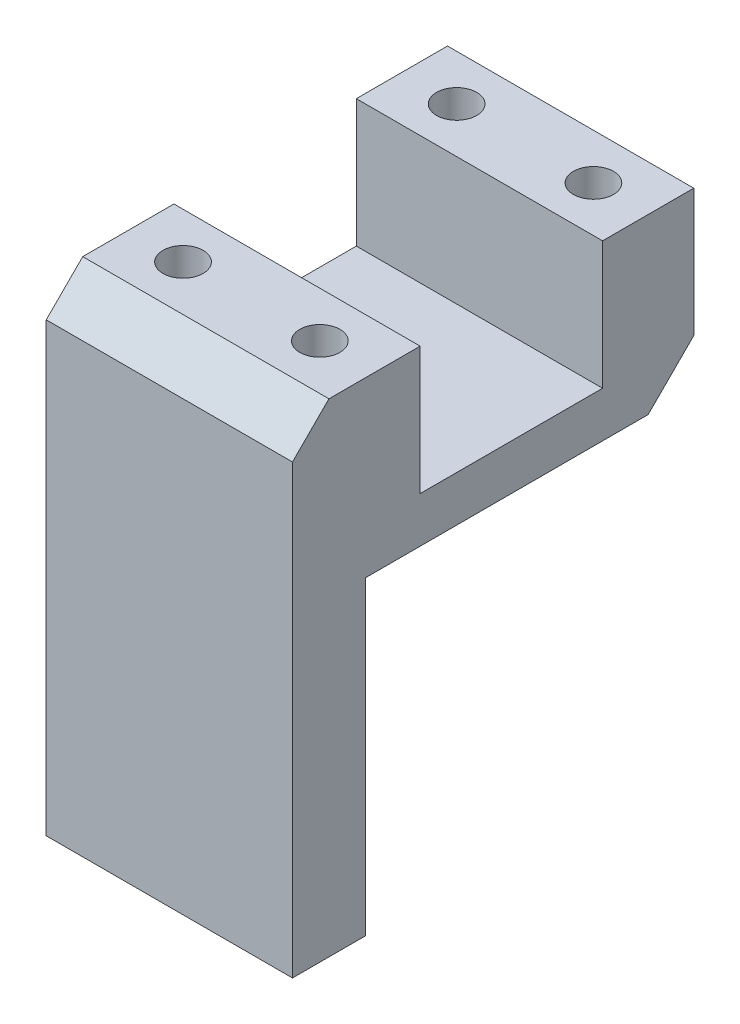
ISO-10303-21;
HEADER;
FILE_DESCRIPTION(('STEP AP214'),'2;1');
FILE_NAME('part.step','',(''),(''),'','','');
FILE_SCHEMA(('AUTOMOTIVE_DESIGN { 1 0 10303 214 1 1 1 1 }'));
ENDSEC;
DATA;
#1=APPLICATION_CONTEXT('core data for automotive mechanical design processes');
#2=APPLICATION_PROTOCOL_DEFINITION('international standard','automotive_design',2000,#1);
#3=PRODUCT_CONTEXT('',#1,'mechanical');
#4=PRODUCT('Part','Part','',(#3));
#5=PRODUCT_RELATED_PRODUCT_CATEGORY('part','',(#4));
#6=PRODUCT_DEFINITION_FORMATION('','',#4);
#7=PRODUCT_DEFINITION_CONTEXT('part definition',#1,'design');
#8=PRODUCT_DEFINITION('design','',#6,#7);
#9=PRODUCT_DEFINITION_SHAPE('','',#8);
#10=(LENGTH_UNIT() NAMED_UNIT(*) SI_UNIT(.MILLI.,.METRE.));
#11=(NAMED_UNIT(*) PLANE_ANGLE_UNIT() SI_UNIT($,.RADIAN.));
#12=(NAMED_UNIT(*) SI_UNIT($,.STERADIAN.) SOLID_ANGLE_UNIT());
#13=UNCERTAINTY_MEASURE_WITH_UNIT(LENGTH_MEASURE(1.E-05),#10,'distance_accuracy_value','');
#14=(GEOMETRIC_REPRESENTATION_CONTEXT(3) GLOBAL_UNCERTAINTY_ASSIGNED_CONTEXT((#13)) GLOBAL_UNIT_ASSIGNED_CONTEXT((#10,
#11,#12)) REPRESENTATION_CONTEXT('',''));
#15=CARTESIAN_POINT('',(0.,0.,0.));
#16=DIRECTION('',(0.,0.,1.));
#17=DIRECTION('',(1.,0.,0.));
#18=AXIS2_PLACEMENT_3D('',#15,#16,#17);
#19=CARTESIAN_POINT('',(8.5725,-2.54,2.54));
#20=DIRECTION('',(0.,1.,0.));
#21=DIRECTION('',(0.,0.,1.));
#22=AXIS2_PLACEMENT_3D('',#19,#20,#21);
#23=PLANE('',#22);
#24=DIRECTION('',(0.,0.,-1.));
#25=VECTOR('',#24,1.);
#26=CARTESIAN_POINT('',(-8.5725,-2.54,2.54));
#27=LINE('',#26,#25);
#28=CARTESIAN_POINT('',(-8.5725,-2.54,2.54));
#29=VERTEX_POINT('',#28);
#30=CARTESIAN_POINT('',(-8.5725,-2.54,-2.54));
#31=VERTEX_POINT('',#30);
#32=EDGE_CURVE('E464',#29,#31,#27,.T.);
#33=ORIENTED_EDGE('',*,*,#32,.T.);
#34=DIRECTION('',(-1.,0.,0.));
#35=VECTOR('',#34,1.);
#36=CARTESIAN_POINT('',(8.5725,-2.54,-2.54));
#37=LINE('',#36,#35);
#38=CARTESIAN_POINT('',(8.5725,-2.54,-2.54));
#39=VERTEX_POINT('',#38);
#40=EDGE_CURVE('E11',#39,#31,#37,.T.);
#41=ORIENTED_EDGE('',*,*,#40,.F.);
#42=DIRECTION('',(0.,0.,-1.));
#43=VECTOR('',#42,1.);
#44=CARTESIAN_POINT('',(8.5725,-2.54,2.54));
#45=LINE('',#44,#43);
#46=CARTESIAN_POINT('',(8.5725,-2.54,2.54));
#47=VERTEX_POINT('',#46);
#48=EDGE_CURVE('E504',#47,#39,#45,.T.);
#49=ORIENTED_EDGE('',*,*,#48,.F.);
#50=DIRECTION('',(-1.,0.,0.));
#51=VECTOR('',#50,1.);
#52=CARTESIAN_POINT('',(8.5725,-2.54,2.54));
#53=LINE('',#52,#51);
#54=EDGE_CURVE('E477',#47,#29,#53,.T.);
#55=ORIENTED_EDGE('',*,*,#54,.T.);
#56=EDGE_LOOP('',(#33,#41,#49,#55));
#57=FACE_BOUND('',#56,.T.);
#58=ADVANCED_FACE('F372',(#57),#23,.F.);
#59=CARTESIAN_POINT('',(8.5725,-2.54,-2.54));
#60=DIRECTION('',(0.,0.,1.));
#61=DIRECTION('',(0.,-1.,0.));
#62=AXIS2_PLACEMENT_3D('',#59,#60,#61);
#63=PLANE('',#62);
#64=DIRECTION('',(0.,1.,0.));
#65=VECTOR('',#64,1.);
#66=CARTESIAN_POINT('',(-8.5725,-2.54,-2.54));
#67=LINE('',#66,#65);
#68=CARTESIAN_POINT('',(-8.5725,19.05,-2.54));
#69=VERTEX_POINT('',#68);
#70=EDGE_CURVE('E460',#31,#69,#67,.T.);
#71=ORIENTED_EDGE('',*,*,#70,.T.);
#72=DIRECTION('',(-1.,0.,0.));
#73=VECTOR('',#72,1.);
#74=CARTESIAN_POINT('',(8.5725,19.05,-2.54));
#75=LINE('',#74,#73);
#76=CARTESIAN_POINT('',(8.5725,19.05,-2.54));
#77=VERTEX_POINT('',#76);
#78=EDGE_CURVE('E379',#77,#69,#75,.T.);
#79=ORIENTED_EDGE('',*,*,#78,.F.);
#80=DIRECTION('',(0.,1.,0.));
#81=VECTOR('',#80,1.);
#82=CARTESIAN_POINT('',(8.5725,-2.54,-2.54));
#83=LINE('',#82,#81);
#84=EDGE_CURVE('E473',#39,#77,#83,.T.);
#85=ORIENTED_EDGE('',*,*,#84,.F.);
#86=ORIENTED_EDGE('',*,*,#40,.T.);
#87=EDGE_LOOP('',(#71,#79,#85,#86));
#88=FACE_BOUND('',#87,.T.);
#89=ADVANCED_FACE('F472',(#88),#63,.F.);
#90=CARTESIAN_POINT('',(8.5725,19.05,-2.54));
#91=DIRECTION('',(0.,1.,0.));
#92=DIRECTION('',(0.,0.,1.));
#93=AXIS2_PLACEMENT_3D('',#90,#91,#92);
#94=PLANE('',#93);
#95=DIRECTION('',(0.,0.,-1.));
#96=VECTOR('',#95,1.);
#97=CARTESIAN_POINT('',(-8.5725,19.05,-2.54));
#98=LINE('',#97,#96);
#99=CARTESIAN_POINT('',(-8.5725,19.05,-22.225));
#100=VERTEX_POINT('',#99);
#101=EDGE_CURVE('E466',#69,#100,#98,.T.);
#102=ORIENTED_EDGE('',*,*,#101,.T.);
#103=DIRECTION('',(-1.,0.,0.));
#104=VECTOR('',#103,1.);
#105=CARTESIAN_POINT('',(8.5725,19.05,-22.225));
#106=LINE('',#105,#104);
#107=CARTESIAN_POINT('',(8.5725,19.05,-22.225));
#108=VERTEX_POINT('',#107);
#109=EDGE_CURVE('E550',#108,#100,#106,.T.);
#110=ORIENTED_EDGE('',*,*,#109,.F.);
#111=DIRECTION('',(0.,0.,-1.));
#112=VECTOR('',#111,1.);
#113=CARTESIAN_POINT('',(8.5725,19.05,-2.54));
#114=LINE('',#113,#112);
#115=EDGE_CURVE('E507',#77,#108,#114,.T.);
#116=ORIENTED_EDGE('',*,*,#115,.F.);
#117=ORIENTED_EDGE('',*,*,#78,.T.);
#118=EDGE_LOOP('',(#102,#110,#116,#117));
#119=FACE_BOUND('',#118,.T.);
#120=ADVANCED_FACE('F554',(#119),#94,.F.);
#121=CARTESIAN_POINT('',(8.5725,19.05,-22.225));
#122=DIRECTION('',(0.,0.707106781186546,0.707106781186549));
#123=DIRECTION('',(0.,-0.707106781186549,0.707106781186546));
#124=AXIS2_PLACEMENT_3D('',#121,#122,#123);
#125=PLANE('',#124);
#126=DIRECTION('',(0.,0.707106781186549,-0.707106781186546));
#127=VECTOR('',#126,1.);
#128=CARTESIAN_POINT('',(-8.5725,19.05,-22.225));
#129=LINE('',#128,#127);
#130=CARTESIAN_POINT('',(-8.5725,22.225,-25.4));
#131=VERTEX_POINT('',#130);
#132=EDGE_CURVE('E486',#100,#131,#129,.T.);
#133=ORIENTED_EDGE('',*,*,#132,.T.);
#134=DIRECTION('',(-1.,0.,0.));
#135=VECTOR('',#134,1.);
#136=CARTESIAN_POINT('',(8.5725,22.225,-25.4));
#137=LINE('',#136,#135);
#138=CARTESIAN_POINT('',(8.5725,22.225,-25.4));
#139=VERTEX_POINT('',#138);
#140=EDGE_CURVE('E547',#139,#131,#137,.T.);
#141=ORIENTED_EDGE('',*,*,#140,.F.);
#142=DIRECTION('',(0.,0.707106781186549,-0.707106781186546));
#143=VECTOR('',#142,1.);
#144=CARTESIAN_POINT('',(8.5725,19.05,-22.225));
#145=LINE('',#144,#143);
#146=EDGE_CURVE('E509',#108,#139,#145,.T.);
#147=ORIENTED_EDGE('',*,*,#146,.F.);
#148=ORIENTED_EDGE('',*,*,#109,.T.);
#149=EDGE_LOOP('',(#133,#141,#147,#148));
#150=FACE_BOUND('',#149,.T.);
#151=ADVANCED_FACE('F562',(#150),#125,.F.);
#152=CARTESIAN_POINT('',(8.5725,22.225,-25.4));
#153=DIRECTION('',(0.,0.,1.));
#154=DIRECTION('',(1.,0.,0.));
#155=AXIS2_PLACEMENT_3D('',#152,#153,#154);
#156=PLANE('',#155);
#157=DIRECTION('',(0.,1.,0.));
#158=VECTOR('',#157,1.);
#159=CARTESIAN_POINT('',(-8.5725,22.225,-25.4));
#160=LINE('',#159,#158);
#161=CARTESIAN_POINT('',(-8.5725,31.115,-25.4));
#162=VERTEX_POINT('',#161);
#163=EDGE_CURVE('E488',#131,#162,#160,.T.);
#164=ORIENTED_EDGE('',*,*,#163,.T.);
#165=DIRECTION('',(-1.,0.,0.));
#166=VECTOR('',#165,1.);
#167=CARTESIAN_POINT('',(8.5725,31.115,-25.4));
#168=LINE('',#167,#166);
#169=CARTESIAN_POINT('',(8.5725,31.115,-25.4));
#170=VERTEX_POINT('',#169);
#171=EDGE_CURVE('E544',#170,#162,#168,.T.);
#172=ORIENTED_EDGE('',*,*,#171,.F.);
#173=DIRECTION('',(0.,1.,0.));
#174=VECTOR('',#173,1.);
#175=CARTESIAN_POINT('',(8.5725,22.225,-25.4));
#176=LINE('',#175,#174);
#177=EDGE_CURVE('E511',#139,#170,#176,.T.);
#178=ORIENTED_EDGE('',*,*,#177,.F.);
#179=ORIENTED_EDGE('',*,*,#140,.T.);
#180=EDGE_LOOP('',(#164,#172,#178,#179));
#181=FACE_BOUND('',#180,.T.);
#182=ADVANCED_FACE('F565',(#181),#156,.F.);
#183=CARTESIAN_POINT('',(8.5725,31.115,-25.4));
#184=DIRECTION('',(0.,-1.,0.));
#185=DIRECTION('',(0.,0.,-1.));
#186=AXIS2_PLACEMENT_3D('',#183,#184,#185);
#187=PLANE('',#186);
#188=CARTESIAN_POINT('',(-4.7625,31.115,-22.225));
#189=DIRECTION('',(0.,1.,0.));
#190=DIRECTION('',(0.,0.,1.));
#191=AXIS2_PLACEMENT_3D('',#188,#189,#190);
#192=CIRCLE('',#191,1.397);
#193=CARTESIAN_POINT('',(-4.7625,31.115,-20.828));
#194=VERTEX_POINT('',#193);
#195=EDGE_CURVE('E643',#194,#194,#192,.T.);
#196=ORIENTED_EDGE('',*,*,#195,.F.);
#197=EDGE_LOOP('',(#196));
#198=FACE_BOUND('',#197,.T.);
#199=CARTESIAN_POINT('',(4.7625,31.115,-22.225));
#200=DIRECTION('',(0.,1.,0.));
#201=DIRECTION('',(0.,0.,1.));
#202=AXIS2_PLACEMENT_3D('',#199,#200,#201);
#203=CIRCLE('',#202,1.397);
#204=CARTESIAN_POINT('',(4.7625,31.115,-20.828));
#205=VERTEX_POINT('',#204);
#206=EDGE_CURVE('E481',#205,#205,#203,.T.);
#207=ORIENTED_EDGE('',*,*,#206,.F.);
#208=EDGE_LOOP('',(#207));
#209=FACE_BOUND('',#208,.T.);
#210=DIRECTION('',(0.,0.,1.));
#211=VECTOR('',#210,1.);
#212=CARTESIAN_POINT('',(-8.5725,31.115,-25.4));
#213=LINE('',#212,#211);
#214=CARTESIAN_POINT('',(-8.5725,31.115,-19.05));
#215=VERTEX_POINT('',#214);
#216=EDGE_CURVE('E490',#162,#215,#213,.T.);
#217=ORIENTED_EDGE('',*,*,#216,.T.);
#218=DIRECTION('',(-1.,0.,0.));
#219=VECTOR('',#218,1.);
#220=CARTESIAN_POINT('',(8.5725,31.115,-19.05));
#221=LINE('',#220,#219);
#222=CARTESIAN_POINT('',(8.5725,31.115,-19.05));
#223=VERTEX_POINT('',#222);
#224=EDGE_CURVE('E541',#223,#215,#221,.T.);
#225=ORIENTED_EDGE('',*,*,#224,.F.);
#226=DIRECTION('',(0.,0.,1.));
#227=VECTOR('',#226,1.);
#228=CARTESIAN_POINT('',(8.5725,31.115,-25.4));
#229=LINE('',#228,#227);
#230=EDGE_CURVE('E513',#170,#223,#229,.T.);
#231=ORIENTED_EDGE('',*,*,#230,.F.);
#232=ORIENTED_EDGE('',*,*,#171,.T.);
#233=EDGE_LOOP('',(#217,#225,#231,#232));
#234=FACE_BOUND('',#233,.T.);
#235=ADVANCED_FACE('F570',(#198,#209,#234),#187,.F.);
#236=CARTESIAN_POINT('',(8.5725,31.115,-19.05));
#237=DIRECTION('',(0.,0.,-1.));
#238=DIRECTION('',(0.,1.,0.));
#239=AXIS2_PLACEMENT_3D('',#236,#237,#238);
#240=PLANE('',#239);
#241=DIRECTION('',(0.,-1.,0.));
#242=VECTOR('',#241,1.);
#243=CARTESIAN_POINT('',(-8.5725,31.115,-19.05));
#244=LINE('',#243,#242);
#245=CARTESIAN_POINT('',(-8.5725,22.225,-19.05));
#246=VERTEX_POINT('',#245);
#247=EDGE_CURVE('E492',#215,#246,#244,.T.);
#248=ORIENTED_EDGE('',*,*,#247,.T.);
#249=DIRECTION('',(-1.,0.,0.));
#250=VECTOR('',#249,1.);
#251=CARTESIAN_POINT('',(8.5725,22.225,-19.05));
#252=LINE('',#251,#250);
#253=CARTESIAN_POINT('',(8.5725,22.225,-19.05));
#254=VERTEX_POINT('',#253);
#255=EDGE_CURVE('E538',#254,#246,#252,.T.);
#256=ORIENTED_EDGE('',*,*,#255,.F.);
#257=DIRECTION('',(0.,-1.,0.));
#258=VECTOR('',#257,1.);
#259=CARTESIAN_POINT('',(8.5725,31.115,-19.05));
#260=LINE('',#259,#258);
#261=EDGE_CURVE('E515',#223,#254,#260,.T.);
#262=ORIENTED_EDGE('',*,*,#261,.F.);
#263=ORIENTED_EDGE('',*,*,#224,.T.);
#264=EDGE_LOOP('',(#248,#256,#262,#263));
#265=FACE_BOUND('',#264,.T.);
#266=ADVANCED_FACE('F576',(#265),#240,.F.);
#267=CARTESIAN_POINT('',(8.5725,22.225,-19.05));
#268=DIRECTION('',(0.,-1.,0.));
#269=DIRECTION('',(0.,0.,-1.));
#270=AXIS2_PLACEMENT_3D('',#267,#268,#269);
#271=PLANE('',#270);
#272=DIRECTION('',(0.,0.,1.));
#273=VECTOR('',#272,1.);
#274=CARTESIAN_POINT('',(-8.5725,22.225,-19.05));
#275=LINE('',#274,#273);
#276=CARTESIAN_POINT('',(-8.5725,22.225,-6.34999999999999));
#277=VERTEX_POINT('',#276);
#278=EDGE_CURVE('E494',#246,#277,#275,.T.);
#279=ORIENTED_EDGE('',*,*,#278,.T.);
#280=DIRECTION('',(-1.,0.,0.));
#281=VECTOR('',#280,1.);
#282=CARTESIAN_POINT('',(8.5725,22.225,-6.34999999999999));
#283=LINE('',#282,#281);
#284=CARTESIAN_POINT('',(8.5725,22.225,-6.34999999999999));
#285=VERTEX_POINT('',#284);
#286=EDGE_CURVE('E535',#285,#277,#283,.T.);
#287=ORIENTED_EDGE('',*,*,#286,.F.);
#288=DIRECTION('',(0.,0.,1.));
#289=VECTOR('',#288,1.);
#290=CARTESIAN_POINT('',(8.5725,22.225,-19.05));
#291=LINE('',#290,#289);
#292=EDGE_CURVE('E517',#254,#285,#291,.T.);
#293=ORIENTED_EDGE('',*,*,#292,.F.);
#294=ORIENTED_EDGE('',*,*,#255,.T.);
#295=EDGE_LOOP('',(#279,#287,#293,#294));
#296=FACE_BOUND('',#295,.T.);
#297=ADVANCED_FACE('F580',(#296),#271,.F.);
#298=CARTESIAN_POINT('',(8.5725,22.225,-6.34999999999999));
#299=DIRECTION('',(0.,0.,1.));
#300=DIRECTION('',(0.,-1.,0.));
#301=AXIS2_PLACEMENT_3D('',#298,#299,#300);
#302=PLANE('',#301);
#303=DIRECTION('',(0.,1.,0.));
#304=VECTOR('',#303,1.);
#305=CARTESIAN_POINT('',(-8.5725,22.225,-6.34999999999999));
#306=LINE('',#305,#304);
#307=CARTESIAN_POINT('',(-8.5725,31.115,-6.35));
#308=VERTEX_POINT('',#307);
#309=EDGE_CURVE('E496',#277,#308,#306,.T.);
#310=ORIENTED_EDGE('',*,*,#309,.T.);
#311=DIRECTION('',(-1.,0.,0.));
#312=VECTOR('',#311,1.);
#313=CARTESIAN_POINT('',(8.5725,31.115,-6.35));
#314=LINE('',#313,#312);
#315=CARTESIAN_POINT('',(8.5725,31.115,-6.35));
#316=VERTEX_POINT('',#315);
#317=EDGE_CURVE('E532',#316,#308,#314,.T.);
#318=ORIENTED_EDGE('',*,*,#317,.F.);
#319=DIRECTION('',(0.,1.,0.));
#320=VECTOR('',#319,1.);
#321=CARTESIAN_POINT('',(8.5725,22.225,-6.34999999999999));
#322=LINE('',#321,#320);
#323=EDGE_CURVE('E519',#285,#316,#322,.T.);
#324=ORIENTED_EDGE('',*,*,#323,.F.);
#325=ORIENTED_EDGE('',*,*,#286,.T.);
#326=EDGE_LOOP('',(#310,#318,#324,#325));
#327=FACE_BOUND('',#326,.T.);
#328=ADVANCED_FACE('F585',(#327),#302,.F.);
#329=CARTESIAN_POINT('',(8.5725,31.115,-6.35));
#330=DIRECTION('',(0.,-1.,0.));
#331=DIRECTION('',(0.,0.,-1.));
#332=AXIS2_PLACEMENT_3D('',#329,#330,#331);
#333=PLANE('',#332);
#334=CARTESIAN_POINT('',(-4.7625,31.115,-3.17499999999998));
#335=DIRECTION('',(0.,1.,0.));
#336=DIRECTION('',(0.,0.,1.));
#337=AXIS2_PLACEMENT_3D('',#334,#335,#336);
#338=CIRCLE('',#337,1.397);
#339=CARTESIAN_POINT('',(-4.7625,31.115,-1.77799999999998));
#340=VERTEX_POINT('',#339);
#341=EDGE_CURVE('E634',#340,#340,#338,.T.);
#342=ORIENTED_EDGE('',*,*,#341,.F.);
#343=EDGE_LOOP('',(#342));
#344=FACE_BOUND('',#343,.T.);
#345=CARTESIAN_POINT('',(4.7625,31.115,-3.17499999999998));
#346=DIRECTION('',(0.,1.,0.));
#347=DIRECTION('',(0.,0.,1.));
#348=AXIS2_PLACEMENT_3D('',#345,#346,#347);
#349=CIRCLE('',#348,1.397);
#350=CARTESIAN_POINT('',(4.7625,31.115,-1.77799999999998));
#351=VERTEX_POINT('',#350);
#352=EDGE_CURVE('E637',#351,#351,#349,.T.);
#353=ORIENTED_EDGE('',*,*,#352,.F.);
#354=EDGE_LOOP('',(#353));
#355=FACE_BOUND('',#354,.T.);
#356=DIRECTION('',(0.,0.,1.));
#357=VECTOR('',#356,1.);
#358=CARTESIAN_POINT('',(-8.5725,31.115,-6.35));
#359=LINE('',#358,#357);
#360=CARTESIAN_POINT('',(-8.5725,31.115,0.));
#361=VERTEX_POINT('',#360);
#362=EDGE_CURVE('E498',#308,#361,#359,.T.);
#363=ORIENTED_EDGE('',*,*,#362,.T.);
#364=DIRECTION('',(-1.,0.,0.));
#365=VECTOR('',#364,1.);
#366=CARTESIAN_POINT('',(8.5725,31.115,0.));
#367=LINE('',#366,#365);
#368=CARTESIAN_POINT('',(8.5725,31.115,0.));
#369=VERTEX_POINT('',#368);
#370=EDGE_CURVE('E529',#369,#361,#367,.T.);
#371=ORIENTED_EDGE('',*,*,#370,.F.);
#372=DIRECTION('',(0.,0.,1.));
#373=VECTOR('',#372,1.);
#374=CARTESIAN_POINT('',(8.5725,31.115,-6.35));
#375=LINE('',#374,#373);
#376=EDGE_CURVE('E521',#316,#369,#375,.T.);
#377=ORIENTED_EDGE('',*,*,#376,.F.);
#378=ORIENTED_EDGE('',*,*,#317,.T.);
#379=EDGE_LOOP('',(#363,#371,#377,#378));
#380=FACE_BOUND('',#379,.T.);
#381=ADVANCED_FACE('F589',(#344,#355,#380),#333,.F.);
#382=CARTESIAN_POINT('',(8.5725,31.115,0.));
#383=DIRECTION('',(0.,-0.707106781186546,-0.707106781186549));
#384=DIRECTION('',(0.,0.707106781186549,-0.707106781186546));
#385=AXIS2_PLACEMENT_3D('',#382,#383,#384);
#386=PLANE('',#385);
#387=DIRECTION('',(0.,-0.707106781186549,0.707106781186546));
#388=VECTOR('',#387,1.);
#389=CARTESIAN_POINT('',(-8.5725,31.115,0.));
#390=LINE('',#389,#388);
#391=CARTESIAN_POINT('',(-8.5725,28.575,2.54));
#392=VERTEX_POINT('',#391);
#393=EDGE_CURVE('E500',#361,#392,#390,.T.);
#394=ORIENTED_EDGE('',*,*,#393,.T.);
#395=DIRECTION('',(-1.,0.,0.));
#396=VECTOR('',#395,1.);
#397=CARTESIAN_POINT('',(8.5725,28.575,2.54));
#398=LINE('',#397,#396);
#399=CARTESIAN_POINT('',(8.5725,28.575,2.54));
#400=VERTEX_POINT('',#399);
#401=EDGE_CURVE('E526',#400,#392,#398,.T.);
#402=ORIENTED_EDGE('',*,*,#401,.F.);
#403=DIRECTION('',(0.,-0.707106781186549,0.707106781186546));
#404=VECTOR('',#403,1.);
#405=CARTESIAN_POINT('',(8.5725,31.115,0.));
#406=LINE('',#405,#404);
#407=EDGE_CURVE('E391',#369,#400,#406,.T.);
#408=ORIENTED_EDGE('',*,*,#407,.F.);
#409=ORIENTED_EDGE('',*,*,#370,.T.);
#410=EDGE_LOOP('',(#394,#402,#408,#409));
#411=FACE_BOUND('',#410,.T.);
#412=ADVANCED_FACE('F593',(#411),#386,.F.);
#413=CARTESIAN_POINT('',(8.5725,28.575,2.54));
#414=DIRECTION('',(0.,0.,-1.));
#415=DIRECTION('',(0.,1.,0.));
#416=AXIS2_PLACEMENT_3D('',#413,#414,#415);
#417=PLANE('',#416);
#418=DIRECTION('',(0.,-1.,0.));
#419=VECTOR('',#418,1.);
#420=CARTESIAN_POINT('',(-8.5725,28.575,2.54));
#421=LINE('',#420,#419);
#422=EDGE_CURVE('E502',#392,#29,#421,.T.);
#423=ORIENTED_EDGE('',*,*,#422,.T.);
#424=ORIENTED_EDGE('',*,*,#54,.F.);
#425=DIRECTION('',(0.,-1.,0.));
#426=VECTOR('',#425,1.);
#427=CARTESIAN_POINT('',(8.5725,28.575,2.54));
#428=LINE('',#427,#426);
#429=EDGE_CURVE('E386',#400,#47,#428,.T.);
#430=ORIENTED_EDGE('',*,*,#429,.F.);
#431=ORIENTED_EDGE('',*,*,#401,.T.);
#432=EDGE_LOOP('',(#423,#424,#430,#431));
#433=FACE_BOUND('',#432,.T.);
#434=ADVANCED_FACE('F595',(#433),#417,.F.);
#435=CARTESIAN_POINT('',(8.5725,-2.54,-2.54));
#436=DIRECTION('',(1.,0.,0.));
#437=DIRECTION('',(0.,0.,-1.));
#438=AXIS2_PLACEMENT_3D('',#435,#436,#437);
#439=PLANE('',#438);
#440=ORIENTED_EDGE('',*,*,#48,.T.);
#441=ORIENTED_EDGE('',*,*,#84,.T.);
#442=ORIENTED_EDGE('',*,*,#115,.T.);
#443=ORIENTED_EDGE('',*,*,#146,.T.);
#444=ORIENTED_EDGE('',*,*,#177,.T.);
#445=ORIENTED_EDGE('',*,*,#230,.T.);
#446=ORIENTED_EDGE('',*,*,#261,.T.);
#447=ORIENTED_EDGE('',*,*,#292,.T.);
#448=ORIENTED_EDGE('',*,*,#323,.T.);
#449=ORIENTED_EDGE('',*,*,#376,.T.);
#450=ORIENTED_EDGE('',*,*,#407,.T.);
#451=ORIENTED_EDGE('',*,*,#429,.T.);
#452=EDGE_LOOP('',(#440,#441,#442,#443,#444,#445,#446,#447,#448,#449,#450,#451));
#453=FACE_BOUND('',#452,.T.);
#454=ADVANCED_FACE('F557',(#453),#439,.T.);
#455=CARTESIAN_POINT('',(-8.5725,-2.54,-2.54));
#456=DIRECTION('',(1.,0.,0.));
#457=DIRECTION('',(0.,0.,-1.));
#458=AXIS2_PLACEMENT_3D('',#455,#456,#457);
#459=PLANE('',#458);
#460=ORIENTED_EDGE('',*,*,#32,.F.);
#461=ORIENTED_EDGE('',*,*,#422,.F.);
#462=ORIENTED_EDGE('',*,*,#393,.F.);
#463=ORIENTED_EDGE('',*,*,#362,.F.);
#464=ORIENTED_EDGE('',*,*,#309,.F.);
#465=ORIENTED_EDGE('',*,*,#278,.F.);
#466=ORIENTED_EDGE('',*,*,#247,.F.);
#467=ORIENTED_EDGE('',*,*,#216,.F.);
#468=ORIENTED_EDGE('',*,*,#163,.F.);
#469=ORIENTED_EDGE('',*,*,#132,.F.);
#470=ORIENTED_EDGE('',*,*,#101,.F.);
#471=ORIENTED_EDGE('',*,*,#70,.F.);
#472=EDGE_LOOP('',(#460,#461,#462,#463,#464,#465,#466,#467,#468,#469,#470,#471));
#473=FACE_BOUND('',#472,.T.);
#474=ADVANCED_FACE('F461',(#473),#459,.F.);
#475=CARTESIAN_POINT('',(4.7625,24.765,-22.225));
#476=DIRECTION('',(0.,1.,0.));
#477=DIRECTION('',(0.,0.,1.));
#478=AXIS2_PLACEMENT_3D('',#475,#476,#477);
#479=CYLINDRICAL_SURFACE('',#478,1.397);
#480=CARTESIAN_POINT('',(4.7625,24.765,-22.225));
#481=DIRECTION('',(0.,1.,0.));
#482=DIRECTION('',(0.,0.,1.));
#483=AXIS2_PLACEMENT_3D('',#480,#481,#482);
#484=CIRCLE('',#483,1.397);
#485=CARTESIAN_POINT('',(4.7625,24.765,-20.828));
#486=VERTEX_POINT('',#485);
#487=EDGE_CURVE('E478',#486,#486,#484,.T.);
#488=ORIENTED_EDGE('',*,*,#487,.F.);
#489=EDGE_LOOP('',(#488));
#490=FACE_BOUND('',#489,.T.);
#491=ORIENTED_EDGE('',*,*,#206,.T.);
#492=EDGE_LOOP('',(#491));
#493=FACE_BOUND('',#492,.T.);
#494=ADVANCED_FACE('F656',(#490,#493),#479,.F.);
#495=CARTESIAN_POINT('',(4.7625,24.765,-22.225));
#496=DIRECTION('',(0.,1.,0.));
#497=DIRECTION('',(0.,0.,1.));
#498=AXIS2_PLACEMENT_3D('',#495,#496,#497);
#499=PLANE('',#498);
#500=ORIENTED_EDGE('',*,*,#487,.T.);
#501=EDGE_LOOP('',(#500));
#502=FACE_BOUND('',#501,.T.);
#503=ADVANCED_FACE('F658',(#502),#499,.T.);
#504=CARTESIAN_POINT('',(-4.7625,24.765,-22.225));
#505=DIRECTION('',(0.,1.,0.));
#506=DIRECTION('',(0.,0.,1.));
#507=AXIS2_PLACEMENT_3D('',#504,#505,#506);
#508=CYLINDRICAL_SURFACE('',#507,1.397);
#509=CARTESIAN_POINT('',(-4.7625,24.765,-22.225));
#510=DIRECTION('',(0.,1.,0.));
#511=DIRECTION('',(0.,0.,1.));
#512=AXIS2_PLACEMENT_3D('',#509,#510,#511);
#513=CIRCLE('',#512,1.397);
#514=CARTESIAN_POINT('',(-4.7625,24.765,-20.828));
#515=VERTEX_POINT('',#514);
#516=EDGE_CURVE('E651',#515,#515,#513,.T.);
#517=ORIENTED_EDGE('',*,*,#516,.F.);
#518=EDGE_LOOP('',(#517));
#519=FACE_BOUND('',#518,.T.);
#520=ORIENTED_EDGE('',*,*,#195,.T.);
#521=EDGE_LOOP('',(#520));
#522=FACE_BOUND('',#521,.T.);
#523=ADVANCED_FACE('F664',(#519,#522),#508,.F.);
#524=CARTESIAN_POINT('',(-4.7625,24.765,-22.225));
#525=DIRECTION('',(0.,1.,0.));
#526=DIRECTION('',(0.,0.,1.));
#527=AXIS2_PLACEMENT_3D('',#524,#525,#526);
#528=PLANE('',#527);
#529=ORIENTED_EDGE('',*,*,#516,.T.);
#530=EDGE_LOOP('',(#529));
#531=FACE_BOUND('',#530,.T.);
#532=ADVANCED_FACE('F673',(#531),#528,.T.);
#533=CARTESIAN_POINT('',(4.7625,24.765,-3.17499999999998));
#534=DIRECTION('',(0.,1.,0.));
#535=DIRECTION('',(0.,0.,1.));
#536=AXIS2_PLACEMENT_3D('',#533,#534,#535);
#537=CYLINDRICAL_SURFACE('',#536,1.397);
#538=CARTESIAN_POINT('',(4.7625,24.765,-3.17499999999998));
#539=DIRECTION('',(0.,1.,0.));
#540=DIRECTION('',(0.,0.,1.));
#541=AXIS2_PLACEMENT_3D('',#538,#539,#540);
#542=CIRCLE('',#541,1.397);
#543=CARTESIAN_POINT('',(4.7625,24.765,-1.77799999999998));
#544=VERTEX_POINT('',#543);
#545=EDGE_CURVE('E639',#544,#544,#542,.T.);
#546=ORIENTED_EDGE('',*,*,#545,.F.);
#547=EDGE_LOOP('',(#546));
#548=FACE_BOUND('',#547,.T.);
#549=ORIENTED_EDGE('',*,*,#352,.T.);
#550=EDGE_LOOP('',(#549));
#551=FACE_BOUND('',#550,.T.);
#552=ADVANCED_FACE('F677',(#548,#551),#537,.F.);
#553=CARTESIAN_POINT('',(4.7625,24.765,-3.17499999999998));
#554=DIRECTION('',(0.,1.,0.));
#555=DIRECTION('',(0.,0.,1.));
#556=AXIS2_PLACEMENT_3D('',#553,#554,#555);
#557=PLANE('',#556);
#558=ORIENTED_EDGE('',*,*,#545,.T.);
#559=EDGE_LOOP('',(#558));
#560=FACE_BOUND('',#559,.T.);
#561=ADVANCED_FACE('F681',(#560),#557,.T.);
#562=CARTESIAN_POINT('',(-4.7625,24.765,-3.17499999999998));
#563=DIRECTION('',(0.,1.,0.));
#564=DIRECTION('',(0.,0.,1.));
#565=AXIS2_PLACEMENT_3D('',#562,#563,#564);
#566=CYLINDRICAL_SURFACE('',#565,1.397);
#567=CARTESIAN_POINT('',(-4.7625,24.765,-3.17499999999998));
#568=DIRECTION('',(0.,1.,0.));
#569=DIRECTION('',(0.,0.,1.));
#570=AXIS2_PLACEMENT_3D('',#567,#568,#569);
#571=CIRCLE('',#570,1.397);
#572=CARTESIAN_POINT('',(-4.7625,24.765,-1.77799999999998));
#573=VERTEX_POINT('',#572);
#574=EDGE_CURVE('E640',#573,#573,#571,.T.);
#575=ORIENTED_EDGE('',*,*,#574,.F.);
#576=EDGE_LOOP('',(#575));
#577=FACE_BOUND('',#576,.T.);
#578=ORIENTED_EDGE('',*,*,#341,.T.);
#579=EDGE_LOOP('',(#578));
#580=FACE_BOUND('',#579,.T.);
#581=ADVANCED_FACE('F685',(#577,#580),#566,.F.);
#582=CARTESIAN_POINT('',(-4.7625,24.765,-3.17499999999998));
#583=DIRECTION('',(0.,1.,0.));
#584=DIRECTION('',(0.,0.,1.));
#585=AXIS2_PLACEMENT_3D('',#582,#583,#584);
#586=PLANE('',#585);
#587=ORIENTED_EDGE('',*,*,#574,.T.);
#588=EDGE_LOOP('',(#587));
#589=FACE_BOUND('',#588,.T.);
#590=ADVANCED_FACE('F689',(#589),#586,.T.);
#591=CLOSED_SHELL('',(#58,#89,#120,#151,#182,#235,#266,#297,#328,#381,#412,#434,#454,#474,#494,
#503,#523,#532,#552,#561,#581,#590));
#592=MANIFOLD_SOLID_BREP('B2',#591);
#593=ADVANCED_BREP_SHAPE_REPRESENTATION('',(#18,#592),#14);
#594=SHAPE_DEFINITION_REPRESENTATION(#9,#593);
ENDSEC;
END-ISO-10303-21;
